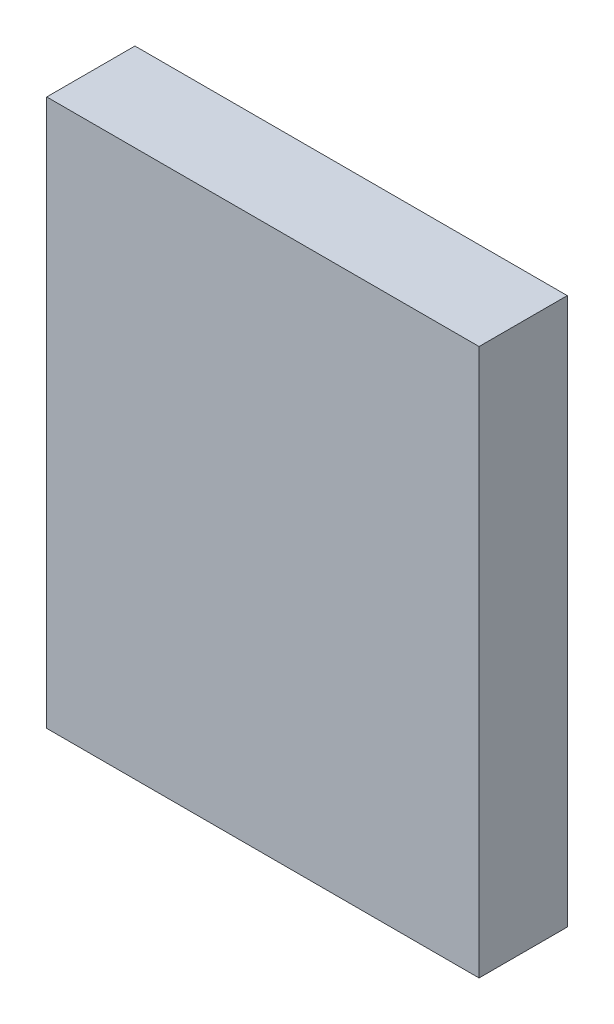
ISO-10303-21;
HEADER;
FILE_DESCRIPTION(('STEP AP214'),'2;1');
FILE_NAME('part.step','',(''),(''),'','','');
FILE_SCHEMA(('AUTOMOTIVE_DESIGN { 1 0 10303 214 1 1 1 1 }'));
ENDSEC;
DATA;
#1=APPLICATION_CONTEXT('core data for automotive mechanical design processes');
#2=APPLICATION_PROTOCOL_DEFINITION('international standard','automotive_design',2000,#1);
#3=PRODUCT_CONTEXT('',#1,'mechanical');
#4=PRODUCT('Part','Part','',(#3));
#5=PRODUCT_RELATED_PRODUCT_CATEGORY('part','',(#4));
#6=PRODUCT_DEFINITION_FORMATION('','',#4);
#7=PRODUCT_DEFINITION_CONTEXT('part definition',#1,'design');
#8=PRODUCT_DEFINITION('design','',#6,#7);
#9=PRODUCT_DEFINITION_SHAPE('','',#8);
#10=(LENGTH_UNIT() NAMED_UNIT(*) SI_UNIT(.MILLI.,.METRE.));
#11=(NAMED_UNIT(*) PLANE_ANGLE_UNIT() SI_UNIT($,.RADIAN.));
#12=(NAMED_UNIT(*) SI_UNIT($,.STERADIAN.) SOLID_ANGLE_UNIT());
#13=UNCERTAINTY_MEASURE_WITH_UNIT(LENGTH_MEASURE(1.E-05),#10,'distance_accuracy_value','');
#14=(GEOMETRIC_REPRESENTATION_CONTEXT(3) GLOBAL_UNCERTAINTY_ASSIGNED_CONTEXT((#13)) GLOBAL_UNIT_ASSIGNED_CONTEXT((#10,
#11,#12)) REPRESENTATION_CONTEXT('',''));
#15=CARTESIAN_POINT('',(0.,0.,0.));
#16=DIRECTION('',(0.,0.,1.));
#17=DIRECTION('',(1.,0.,0.));
#18=AXIS2_PLACEMENT_3D('',#15,#16,#17);
#19=CARTESIAN_POINT('',(-2.4,3.1001,1.));
#20=DIRECTION('',(0.,0.,1.));
#21=DIRECTION('',(1.,0.,0.));
#22=AXIS2_PLACEMENT_3D('',#19,#20,#21);
#23=PLANE('',#22);
#24=DIRECTION('',(0.,1.,0.));
#25=VECTOR('',#24,1.);
#26=CARTESIAN_POINT('',(2.5016,3.1001,1.));
#27=LINE('',#26,#25);
#28=CARTESIAN_POINT('',(2.5016,3.1001,1.));
#29=VERTEX_POINT('',#28);
#30=CARTESIAN_POINT('',(2.5016,-3.1001,1.));
#31=VERTEX_POINT('',#30);
#32=EDGE_CURVE('E53',#29,#31,#27,.F.);
#33=ORIENTED_EDGE('',*,*,#32,.F.);
#34=DIRECTION('',(1.,0.,0.));
#35=VECTOR('',#34,1.);
#36=CARTESIAN_POINT('',(-2.4,3.1001,1.));
#37=LINE('',#36,#35);
#38=CARTESIAN_POINT('',(-2.4,3.1001,1.));
#39=VERTEX_POINT('',#38);
#40=EDGE_CURVE('E68',#39,#29,#37,.T.);
#41=ORIENTED_EDGE('',*,*,#40,.F.);
#42=DIRECTION('',(0.,1.,0.));
#43=VECTOR('',#42,1.);
#44=CARTESIAN_POINT('',(-2.4,-3.1001,1.));
#45=LINE('',#44,#43);
#46=CARTESIAN_POINT('',(-2.4,-3.1001,1.));
#47=VERTEX_POINT('',#46);
#48=EDGE_CURVE('E20',#47,#39,#45,.T.);
#49=ORIENTED_EDGE('',*,*,#48,.F.);
#50=DIRECTION('',(1.,0.,0.));
#51=VECTOR('',#50,1.);
#52=CARTESIAN_POINT('',(2.5016,-3.1001,1.));
#53=LINE('',#52,#51);
#54=EDGE_CURVE('E58',#31,#47,#53,.F.);
#55=ORIENTED_EDGE('',*,*,#54,.F.);
#56=EDGE_LOOP('',(#33,#41,#49,#55));
#57=FACE_BOUND('',#56,.T.);
#58=ADVANCED_FACE('F17',(#57),#23,.T.);
#59=CARTESIAN_POINT('',(-2.4,-3.1001,0.));
#60=DIRECTION('',(-1.,0.,0.));
#61=DIRECTION('',(0.,0.,1.));
#62=AXIS2_PLACEMENT_3D('',#59,#60,#61);
#63=PLANE('',#62);
#64=DIRECTION('',(0.,0.,1.));
#65=VECTOR('',#64,1.);
#66=CARTESIAN_POINT('',(-2.4,3.1001,0.));
#67=LINE('',#66,#65);
#68=CARTESIAN_POINT('',(-2.4,3.1001,0.));
#69=VERTEX_POINT('',#68);
#70=EDGE_CURVE('E79',#69,#39,#67,.T.);
#71=ORIENTED_EDGE('',*,*,#70,.F.);
#72=DIRECTION('',(0.,1.,0.));
#73=VECTOR('',#72,1.);
#74=CARTESIAN_POINT('',(-2.4,3.1001,0.));
#75=LINE('',#74,#73);
#76=CARTESIAN_POINT('',(-2.4,-3.1001,0.));
#77=VERTEX_POINT('',#76);
#78=EDGE_CURVE('E74',#69,#77,#75,.F.);
#79=ORIENTED_EDGE('',*,*,#78,.T.);
#80=DIRECTION('',(0.,0.,-1.));
#81=VECTOR('',#80,1.);
#82=CARTESIAN_POINT('',(-2.4,-3.1001,0.));
#83=LINE('',#82,#81);
#84=EDGE_CURVE('E63',#47,#77,#83,.T.);
#85=ORIENTED_EDGE('',*,*,#84,.F.);
#86=ORIENTED_EDGE('',*,*,#48,.T.);
#87=EDGE_LOOP('',(#71,#79,#85,#86));
#88=FACE_BOUND('',#87,.T.);
#89=ADVANCED_FACE('F73',(#88),#63,.T.);
#90=CARTESIAN_POINT('',(2.5016,-3.1001,0.));
#91=DIRECTION('',(0.,-1.,0.));
#92=DIRECTION('',(0.,0.,-1.));
#93=AXIS2_PLACEMENT_3D('',#90,#91,#92);
#94=PLANE('',#93);
#95=ORIENTED_EDGE('',*,*,#84,.T.);
#96=DIRECTION('',(1.,0.,0.));
#97=VECTOR('',#96,1.);
#98=CARTESIAN_POINT('',(-2.4,-3.1001,0.));
#99=LINE('',#98,#97);
#100=CARTESIAN_POINT('',(2.5016,-3.1001,0.));
#101=VERTEX_POINT('',#100);
#102=EDGE_CURVE('E84',#77,#101,#99,.T.);
#103=ORIENTED_EDGE('',*,*,#102,.T.);
#104=DIRECTION('',(0.,0.,-1.));
#105=VECTOR('',#104,1.);
#106=CARTESIAN_POINT('',(2.5016,-3.1001,0.));
#107=LINE('',#106,#105);
#108=EDGE_CURVE('E65',#31,#101,#107,.T.);
#109=ORIENTED_EDGE('',*,*,#108,.F.);
#110=ORIENTED_EDGE('',*,*,#54,.T.);
#111=EDGE_LOOP('',(#95,#103,#109,#110));
#112=FACE_BOUND('',#111,.T.);
#113=ADVANCED_FACE('F60',(#112),#94,.T.);
#114=CARTESIAN_POINT('',(2.5016,3.1001,0.));
#115=DIRECTION('',(1.,0.,0.));
#116=DIRECTION('',(0.,0.,-1.));
#117=AXIS2_PLACEMENT_3D('',#114,#115,#116);
#118=PLANE('',#117);
#119=ORIENTED_EDGE('',*,*,#108,.T.);
#120=DIRECTION('',(0.,1.,0.));
#121=VECTOR('',#120,1.);
#122=CARTESIAN_POINT('',(2.5016,3.1001,0.));
#123=LINE('',#122,#121);
#124=CARTESIAN_POINT('',(2.5016,3.1001,0.));
#125=VERTEX_POINT('',#124);
#126=EDGE_CURVE('E26',#101,#125,#123,.T.);
#127=ORIENTED_EDGE('',*,*,#126,.T.);
#128=DIRECTION('',(0.,0.,1.));
#129=VECTOR('',#128,1.);
#130=CARTESIAN_POINT('',(2.5016,3.1001,0.));
#131=LINE('',#130,#129);
#132=EDGE_CURVE('E34',#29,#125,#131,.F.);
#133=ORIENTED_EDGE('',*,*,#132,.F.);
#134=ORIENTED_EDGE('',*,*,#32,.T.);
#135=EDGE_LOOP('',(#119,#127,#133,#134));
#136=FACE_BOUND('',#135,.T.);
#137=ADVANCED_FACE('F88',(#136),#118,.T.);
#138=CARTESIAN_POINT('',(-2.4,3.1001,0.));
#139=DIRECTION('',(0.,1.,0.));
#140=DIRECTION('',(0.,0.,1.));
#141=AXIS2_PLACEMENT_3D('',#138,#139,#140);
#142=PLANE('',#141);
#143=ORIENTED_EDGE('',*,*,#132,.T.);
#144=DIRECTION('',(1.,0.,0.));
#145=VECTOR('',#144,1.);
#146=CARTESIAN_POINT('',(-2.4,3.1001,0.));
#147=LINE('',#146,#145);
#148=EDGE_CURVE('E11',#125,#69,#147,.F.);
#149=ORIENTED_EDGE('',*,*,#148,.T.);
#150=ORIENTED_EDGE('',*,*,#70,.T.);
#151=ORIENTED_EDGE('',*,*,#40,.T.);
#152=EDGE_LOOP('',(#143,#149,#150,#151));
#153=FACE_BOUND('',#152,.T.);
#154=ADVANCED_FACE('F91',(#153),#142,.T.);
#155=CARTESIAN_POINT('',(-2.4,3.1001,0.));
#156=DIRECTION('',(0.,0.,1.));
#157=DIRECTION('',(1.,0.,0.));
#158=AXIS2_PLACEMENT_3D('',#155,#156,#157);
#159=PLANE('',#158);
#160=ORIENTED_EDGE('',*,*,#126,.F.);
#161=ORIENTED_EDGE('',*,*,#102,.F.);
#162=ORIENTED_EDGE('',*,*,#78,.F.);
#163=ORIENTED_EDGE('',*,*,#148,.F.);
#164=EDGE_LOOP('',(#160,#161,#162,#163));
#165=FACE_BOUND('',#164,.T.);
#166=ADVANCED_FACE('F90',(#165),#159,.F.);
#167=CLOSED_SHELL('',(#58,#89,#113,#137,#154,#166));
#168=MANIFOLD_SOLID_BREP('B1',#167);
#169=ADVANCED_BREP_SHAPE_REPRESENTATION('',(#18,#168),#14);
#170=SHAPE_DEFINITION_REPRESENTATION(#9,#169);
ENDSEC;
END-ISO-10303-21;
